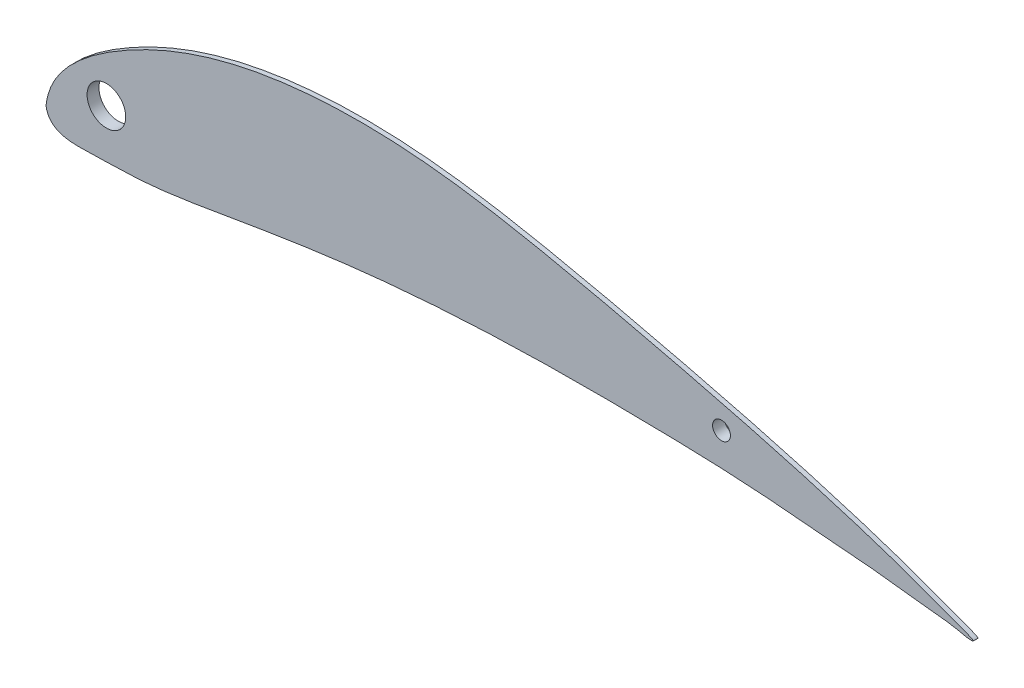
ISO-10303-21;
HEADER;
FILE_DESCRIPTION(('STEP AP214'),'2;1');
FILE_NAME('part.step','',(''),(''),'','','');
FILE_SCHEMA(('AUTOMOTIVE_DESIGN { 1 0 10303 214 1 1 1 1 }'));
ENDSEC;
DATA;
#1=APPLICATION_CONTEXT('core data for automotive mechanical design processes');
#2=APPLICATION_PROTOCOL_DEFINITION('international standard','automotive_design',2000,#1);
#3=PRODUCT_CONTEXT('',#1,'mechanical');
#4=PRODUCT('Part','Part','',(#3));
#5=PRODUCT_RELATED_PRODUCT_CATEGORY('part','',(#4));
#6=PRODUCT_DEFINITION_FORMATION('','',#4);
#7=PRODUCT_DEFINITION_CONTEXT('part definition',#1,'design');
#8=PRODUCT_DEFINITION('design','',#6,#7);
#9=PRODUCT_DEFINITION_SHAPE('','',#8);
#10=(LENGTH_UNIT() NAMED_UNIT(*) SI_UNIT(.MILLI.,.METRE.));
#11=(NAMED_UNIT(*) PLANE_ANGLE_UNIT() SI_UNIT($,.RADIAN.));
#12=(NAMED_UNIT(*) SI_UNIT($,.STERADIAN.) SOLID_ANGLE_UNIT());
#13=UNCERTAINTY_MEASURE_WITH_UNIT(LENGTH_MEASURE(1.E-05),#10,'distance_accuracy_value','');
#14=(GEOMETRIC_REPRESENTATION_CONTEXT(3) GLOBAL_UNCERTAINTY_ASSIGNED_CONTEXT((#13)) GLOBAL_UNIT_ASSIGNED_CONTEXT((#10,
#11,#12)) REPRESENTATION_CONTEXT('',''));
#15=CARTESIAN_POINT('',(0.,0.,0.));
#16=DIRECTION('',(0.,0.,1.));
#17=DIRECTION('',(1.,0.,0.));
#18=AXIS2_PLACEMENT_3D('',#15,#16,#17);
#19=CARTESIAN_POINT('',(0.000560351162113587,0.000130087070423624,1.5875));
#20=CARTESIAN_POINT('',(1.23071418869678,-6.92407609127206,1.5875));
#21=CARTESIAN_POINT('',(15.3166033306834,-6.18906584099094,1.5875));
#22=CARTESIAN_POINT('',(36.4546728163185,-6.09849990105009,1.5875));
#23=CARTESIAN_POINT('',(66.5061971849192,-0.586669106973501,1.5875));
#24=CARTESIAN_POINT('',(110.497331171581,6.18149522271792,1.5875));
#25=CARTESIAN_POINT('',(157.718638091679,9.03065014873911,1.5875));
#26=CARTESIAN_POINT('',(205.10142463584,8.83808028186313,1.5875));
#27=CARTESIAN_POINT('',(235.858814759408,7.87030619247826,1.5875));
#28=CARTESIAN_POINT('',(260.846344817159,5.42741339404395,1.5875));
#29=CARTESIAN_POINT('',(276.264022989737,4.51435670375389,1.5875));
#30=CARTESIAN_POINT('',(293.989507544058,2.09398731346533,1.5875));
#31=CARTESIAN_POINT('',(303.956832564589,1.47095520994628,1.5875));
#32=CARTESIAN_POINT('',(309.846313894505,0.000130087070423666,1.5875));
#33=B_SPLINE_CURVE_WITH_KNOTS('',3,(#19,#20,#21,#22,#23,#24,#25,#26,#27,#28,#29,#30,#31,#32),
.UNSPECIFIED.,.F.,.F.,(4,1,1,1,1,1,1,1,1,1,1,4),(0.,0.0569078595717698,0.106482711504673,
0.214488052979465,0.341297688349143,0.535095665520157,0.664680853556909,0.794660698192775,
0.828978881532905,0.904725108725214,0.942212919019968,1.),.UNSPECIFIED.);
#34=DIRECTION('',(0.,0.,-1.));
#35=VECTOR('',#34,1.);
#36=SURFACE_OF_LINEAR_EXTRUSION('',#33,#35);
#37=CARTESIAN_POINT('',(0.000560351162113587,0.000130087070423624,0.));
#38=CARTESIAN_POINT('',(1.23071418869678,-6.92407609127206,0.));
#39=CARTESIAN_POINT('',(15.3166033306834,-6.18906584099094,0.));
#40=CARTESIAN_POINT('',(36.4546728163185,-6.09849990105009,0.));
#41=CARTESIAN_POINT('',(66.5061971849192,-0.586669106973501,0.));
#42=CARTESIAN_POINT('',(110.497331171581,6.18149522271792,0.));
#43=CARTESIAN_POINT('',(157.718638091679,9.03065014873911,0.));
#44=CARTESIAN_POINT('',(205.10142463584,8.83808028186313,0.));
#45=CARTESIAN_POINT('',(235.858814759408,7.87030619247826,0.));
#46=CARTESIAN_POINT('',(260.846344817159,5.42741339404395,0.));
#47=CARTESIAN_POINT('',(276.264022989737,4.51435670375389,0.));
#48=CARTESIAN_POINT('',(293.989507544058,2.09398731346533,0.));
#49=CARTESIAN_POINT('',(303.956832564589,1.47095520994628,0.));
#50=CARTESIAN_POINT('',(309.846313894505,0.000130087070423666,0.));
#51=B_SPLINE_CURVE_WITH_KNOTS('',3,(#37,#38,#39,#40,#41,#42,#43,#44,#45,#46,#47,#48,#49,#50),
.UNSPECIFIED.,.F.,.F.,(4,1,1,1,1,1,1,1,1,1,1,4),(0.,0.0569078595717698,0.106482711504673,
0.214488052979465,0.341297688349143,0.535095665520157,0.664680853556909,0.794660698192775,
0.828978881532905,0.904725108725214,0.942212919019968,1.),.UNSPECIFIED.);
#52=CARTESIAN_POINT('',(0.000560351162116727,0.000130087070423829,0.));
#53=VERTEX_POINT('',#52);
#54=CARTESIAN_POINT('',(309.846313894505,0.000130087070423864,0.));
#55=VERTEX_POINT('',#54);
#56=EDGE_CURVE('E80',#53,#55,#51,.T.);
#57=ORIENTED_EDGE('',*,*,#56,.T.);
#58=DIRECTION('',(0.,0.,-1.));
#59=VECTOR('',#58,1.);
#60=CARTESIAN_POINT('',(309.846313894505,0.000130087070423864,1.5875));
#61=LINE('',#60,#59);
#62=CARTESIAN_POINT('',(309.846313894505,0.000130087070423864,1.5875));
#63=VERTEX_POINT('',#62);
#64=EDGE_CURVE('E76',#63,#55,#61,.T.);
#65=ORIENTED_EDGE('',*,*,#64,.F.);
#66=CARTESIAN_POINT('',(0.000560351162116727,0.000130087070423829,1.5875));
#67=VERTEX_POINT('',#66);
#68=EDGE_CURVE('E79',#67,#63,#33,.T.);
#69=ORIENTED_EDGE('',*,*,#68,.F.);
#70=DIRECTION('',(0.,0.,-1.));
#71=VECTOR('',#70,1.);
#72=CARTESIAN_POINT('',(0.000560351162116727,0.000130087070423829,1.5875));
#73=LINE('',#72,#71);
#74=EDGE_CURVE('E73',#67,#53,#73,.T.);
#75=ORIENTED_EDGE('',*,*,#74,.T.);
#76=EDGE_LOOP('',(#57,#65,#69,#75));
#77=FACE_BOUND('',#76,.T.);
#78=ADVANCED_FACE('F43',(#77),#36,.F.);
#79=CARTESIAN_POINT('',(309.846313894505,0.000130087070423864,1.5875));
#80=CARTESIAN_POINT('',(314.816918223261,-0.51620674157964,1.5875));
#81=CARTESIAN_POINT('',(301.273197720551,4.38282813873556,1.5875));
#82=CARTESIAN_POINT('',(290.359837670022,8.71099439045776,1.5875));
#83=CARTESIAN_POINT('',(256.952064400645,19.5289209482833,1.5875));
#84=CARTESIAN_POINT('',(217.961060472083,29.6129748944238,1.5875));
#85=CARTESIAN_POINT('',(173.256699242147,40.0411042779434,1.5875));
#86=CARTESIAN_POINT('',(131.400792108858,47.8848319151037,1.5875));
#87=CARTESIAN_POINT('',(89.5976184754884,49.290763053775,1.5875));
#88=CARTESIAN_POINT('',(52.1111282710831,42.0692152748914,1.5875));
#89=CARTESIAN_POINT('',(26.2867198183782,29.9751763284633,1.5875));
#90=CARTESIAN_POINT('',(8.64909202481883,17.8566051741579,1.5875));
#91=CARTESIAN_POINT('',(0.810633126632263,7.35919605469637,1.5875));
#92=CARTESIAN_POINT('',(0.000560351162116727,0.000130087070423829,1.5875));
#93=B_SPLINE_CURVE_WITH_KNOTS('',3,(#79,#80,#81,#82,#83,#84,#85,#86,#87,#88,#89,#90,#91,#92),
.UNSPECIFIED.,.F.,.F.,(4,1,1,1,1,1,1,1,1,1,1,4),(0.,0.0239417713693992,0.070244030177139,
0.147561721425381,0.308455887006792,0.442387865106874,0.551517565626309,0.687091076796298,
0.811391258419108,0.886311735305172,0.939136382225768,1.),.UNSPECIFIED.);
#94=DIRECTION('',(0.,0.,-1.));
#95=VECTOR('',#94,1.);
#96=SURFACE_OF_LINEAR_EXTRUSION('',#93,#95);
#97=CARTESIAN_POINT('',(309.846313894505,0.000130087070423864,0.));
#98=CARTESIAN_POINT('',(314.816918223261,-0.51620674157964,0.));
#99=CARTESIAN_POINT('',(301.273197720551,4.38282813873556,0.));
#100=CARTESIAN_POINT('',(290.359837670022,8.71099439045776,0.));
#101=CARTESIAN_POINT('',(256.952064400645,19.5289209482833,0.));
#102=CARTESIAN_POINT('',(217.961060472083,29.6129748944238,0.));
#103=CARTESIAN_POINT('',(173.256699242147,40.0411042779434,0.));
#104=CARTESIAN_POINT('',(131.400792108858,47.8848319151037,0.));
#105=CARTESIAN_POINT('',(89.5976184754884,49.290763053775,0.));
#106=CARTESIAN_POINT('',(52.1111282710831,42.0692152748914,0.));
#107=CARTESIAN_POINT('',(26.2867198183782,29.9751763284633,0.));
#108=CARTESIAN_POINT('',(8.64909202481883,17.8566051741579,0.));
#109=CARTESIAN_POINT('',(0.810633126632263,7.35919605469637,0.));
#110=CARTESIAN_POINT('',(0.000560351162116727,0.000130087070423829,0.));
#111=B_SPLINE_CURVE_WITH_KNOTS('',3,(#97,#98,#99,#100,#101,#102,#103,#104,#105,#106,#107,#108,
#109,#110),.UNSPECIFIED.,.F.,.F.,(4,1,1,1,1,1,1,1,1,1,1,4),(0.,0.0239417713693992,
0.070244030177139,0.147561721425381,0.308455887006792,0.442387865106874,0.551517565626309,
0.687091076796298,0.811391258419108,0.886311735305172,0.939136382225768,1.),.UNSPECIFIED.);
#112=EDGE_CURVE('E68',#55,#53,#111,.T.);
#113=ORIENTED_EDGE('',*,*,#112,.T.);
#114=ORIENTED_EDGE('',*,*,#74,.F.);
#115=EDGE_CURVE('E60',#63,#67,#93,.T.);
#116=ORIENTED_EDGE('',*,*,#115,.F.);
#117=ORIENTED_EDGE('',*,*,#64,.T.);
#118=EDGE_LOOP('',(#113,#114,#116,#117));
#119=FACE_BOUND('',#118,.T.);
#120=ADVANCED_FACE('F72',(#119),#96,.F.);
#121=CARTESIAN_POINT('',(153.387816973495,8.33338198857885,1.5875));
#122=DIRECTION('',(0.,0.,-1.));
#123=DIRECTION('',(-1.,0.,0.));
#124=AXIS2_PLACEMENT_3D('',#121,#122,#123);
#125=PLANE('',#124);
#126=CARTESIAN_POINT('',(20.32,10.16,1.5875));
#127=DIRECTION('',(0.,0.,1.));
#128=DIRECTION('',(1.,0.,0.));
#129=AXIS2_PLACEMENT_3D('',#126,#127,#128);
#130=CIRCLE('',#129,6.5);
#131=CARTESIAN_POINT('',(26.82,10.16,1.5875));
#132=VERTEX_POINT('',#131);
#133=EDGE_CURVE('E232',#132,#132,#130,.T.);
#134=ORIENTED_EDGE('',*,*,#133,.F.);
#135=EDGE_LOOP('',(#134));
#136=FACE_BOUND('',#135,.T.);
#137=CARTESIAN_POINT('',(227.296313894505,19.0501300870704,1.5875));
#138=DIRECTION('',(0.,0.,1.));
#139=DIRECTION('',(1.,0.,0.));
#140=AXIS2_PLACEMENT_3D('',#137,#138,#139);
#141=CIRCLE('',#140,2.99999999999999);
#142=CARTESIAN_POINT('',(230.296313894505,19.0501300870704,1.5875));
#143=VERTEX_POINT('',#142);
#144=EDGE_CURVE('E233',#143,#143,#141,.T.);
#145=ORIENTED_EDGE('',*,*,#144,.F.);
#146=EDGE_LOOP('',(#145));
#147=FACE_BOUND('',#146,.T.);
#148=ORIENTED_EDGE('',*,*,#68,.T.);
#149=ORIENTED_EDGE('',*,*,#115,.T.);
#150=EDGE_LOOP('',(#148,#149));
#151=FACE_BOUND('',#150,.T.);
#152=ADVANCED_FACE('F118',(#136,#147,#151),#125,.F.);
#153=CARTESIAN_POINT('',(153.387816973495,8.33338198857885,0.));
#154=DIRECTION('',(0.,0.,-1.));
#155=DIRECTION('',(-1.,0.,0.));
#156=AXIS2_PLACEMENT_3D('',#153,#154,#155);
#157=PLANE('',#156);
#158=CARTESIAN_POINT('',(20.32,10.16,0.));
#159=DIRECTION('',(0.,0.,-1.));
#160=DIRECTION('',(-1.,0.,0.));
#161=AXIS2_PLACEMENT_3D('',#158,#159,#160);
#162=CIRCLE('',#161,8.);
#163=CARTESIAN_POINT('',(12.32,10.16,0.));
#164=VERTEX_POINT('',#163);
#165=EDGE_CURVE('E11',#164,#164,#162,.T.);
#166=ORIENTED_EDGE('',*,*,#165,.F.);
#167=EDGE_LOOP('',(#166));
#168=FACE_BOUND('',#167,.T.);
#169=CARTESIAN_POINT('',(227.296313894505,19.0501300870704,0.));
#170=DIRECTION('',(0.,0.,-1.));
#171=DIRECTION('',(-1.,0.,0.));
#172=AXIS2_PLACEMENT_3D('',#169,#170,#171);
#173=CIRCLE('',#172,4.49999999999999);
#174=CARTESIAN_POINT('',(222.796313894505,19.0501300870704,0.));
#175=VERTEX_POINT('',#174);
#176=EDGE_CURVE('E53',#175,#175,#173,.T.);
#177=ORIENTED_EDGE('',*,*,#176,.F.);
#178=EDGE_LOOP('',(#177));
#179=FACE_BOUND('',#178,.T.);
#180=ORIENTED_EDGE('',*,*,#56,.F.);
#181=ORIENTED_EDGE('',*,*,#112,.F.);
#182=EDGE_LOOP('',(#180,#181));
#183=FACE_BOUND('',#182,.T.);
#184=ADVANCED_FACE('F85',(#168,#179,#183),#157,.T.);
#185=CARTESIAN_POINT('',(227.296313894505,19.0501300870704,-2.4125));
#186=DIRECTION('',(0.,0.,1.));
#187=DIRECTION('',(1.,0.,0.));
#188=AXIS2_PLACEMENT_3D('',#185,#186,#187);
#189=CYLINDRICAL_SURFACE('',#188,2.99999999999999);
#190=CARTESIAN_POINT('',(227.296313894505,19.0501300870704,-2.4125));
#191=DIRECTION('',(0.,0.,1.));
#192=DIRECTION('',(1.,0.,0.));
#193=AXIS2_PLACEMENT_3D('',#190,#191,#192);
#194=CIRCLE('',#193,2.99999999999999);
#195=CARTESIAN_POINT('',(230.296313894505,19.0501300870704,-2.4125));
#196=VERTEX_POINT('',#195);
#197=EDGE_CURVE('E91',#196,#196,#194,.T.);
#198=ORIENTED_EDGE('',*,*,#197,.F.);
#199=EDGE_LOOP('',(#198));
#200=FACE_BOUND('',#199,.T.);
#201=ORIENTED_EDGE('',*,*,#144,.T.);
#202=EDGE_LOOP('',(#201));
#203=FACE_BOUND('',#202,.T.);
#204=ADVANCED_FACE('F117',(#200,#203),#189,.F.);
#205=CARTESIAN_POINT('',(227.296313894505,19.0501300870704,-2.4125));
#206=DIRECTION('',(0.,0.,1.));
#207=DIRECTION('',(1.,0.,0.));
#208=AXIS2_PLACEMENT_3D('',#205,#206,#207);
#209=CYLINDRICAL_SURFACE('',#208,4.49999999999999);
#210=ORIENTED_EDGE('',*,*,#176,.T.);
#211=EDGE_LOOP('',(#210));
#212=FACE_BOUND('',#211,.T.);
#213=CARTESIAN_POINT('',(227.296313894505,19.0501300870704,-2.4125));
#214=DIRECTION('',(0.,0.,1.));
#215=DIRECTION('',(1.,0.,0.));
#216=AXIS2_PLACEMENT_3D('',#213,#214,#215);
#217=CIRCLE('',#216,4.49999999999999);
#218=CARTESIAN_POINT('',(231.796313894505,19.0501300870704,-2.4125));
#219=VERTEX_POINT('',#218);
#220=EDGE_CURVE('E87',#219,#219,#217,.T.);
#221=ORIENTED_EDGE('',*,*,#220,.T.);
#222=EDGE_LOOP('',(#221));
#223=FACE_BOUND('',#222,.T.);
#224=ADVANCED_FACE('F113',(#212,#223),#209,.T.);
#225=CARTESIAN_POINT('',(0.,0.,-2.4125));
#226=DIRECTION('',(0.,0.,1.));
#227=DIRECTION('',(1.,0.,0.));
#228=AXIS2_PLACEMENT_3D('',#225,#226,#227);
#229=PLANE('',#228);
#230=ORIENTED_EDGE('',*,*,#197,.T.);
#231=EDGE_LOOP('',(#230));
#232=FACE_BOUND('',#231,.T.);
#233=ORIENTED_EDGE('',*,*,#220,.F.);
#234=EDGE_LOOP('',(#233));
#235=FACE_BOUND('',#234,.T.);
#236=ADVANCED_FACE('F165',(#232,#235),#229,.F.);
#237=CARTESIAN_POINT('',(20.32,10.16,-2.4125));
#238=DIRECTION('',(0.,0.,1.));
#239=DIRECTION('',(1.,0.,0.));
#240=AXIS2_PLACEMENT_3D('',#237,#238,#239);
#241=CYLINDRICAL_SURFACE('',#240,6.5);
#242=CARTESIAN_POINT('',(20.32,10.16,-2.4125));
#243=DIRECTION('',(0.,0.,1.));
#244=DIRECTION('',(1.,0.,0.));
#245=AXIS2_PLACEMENT_3D('',#242,#243,#244);
#246=CIRCLE('',#245,6.5);
#247=CARTESIAN_POINT('',(26.82,10.16,-2.4125));
#248=VERTEX_POINT('',#247);
#249=EDGE_CURVE('E219',#248,#248,#246,.T.);
#250=ORIENTED_EDGE('',*,*,#249,.F.);
#251=EDGE_LOOP('',(#250));
#252=FACE_BOUND('',#251,.T.);
#253=ORIENTED_EDGE('',*,*,#133,.T.);
#254=EDGE_LOOP('',(#253));
#255=FACE_BOUND('',#254,.T.);
#256=ADVANCED_FACE('F161',(#252,#255),#241,.F.);
#257=CARTESIAN_POINT('',(20.32,10.16,-2.4125));
#258=DIRECTION('',(0.,0.,1.));
#259=DIRECTION('',(1.,0.,0.));
#260=AXIS2_PLACEMENT_3D('',#257,#258,#259);
#261=CYLINDRICAL_SURFACE('',#260,8.);
#262=ORIENTED_EDGE('',*,*,#165,.T.);
#263=EDGE_LOOP('',(#262));
#264=FACE_BOUND('',#263,.T.);
#265=CARTESIAN_POINT('',(20.32,10.16,-2.4125));
#266=DIRECTION('',(0.,0.,1.));
#267=DIRECTION('',(1.,0.,0.));
#268=AXIS2_PLACEMENT_3D('',#265,#266,#267);
#269=CIRCLE('',#268,8.);
#270=CARTESIAN_POINT('',(28.32,10.16,-2.4125));
#271=VERTEX_POINT('',#270);
#272=EDGE_CURVE('E215',#271,#271,#269,.T.);
#273=ORIENTED_EDGE('',*,*,#272,.T.);
#274=EDGE_LOOP('',(#273));
#275=FACE_BOUND('',#274,.T.);
#276=ADVANCED_FACE('F164',(#264,#275),#261,.T.);
#277=CARTESIAN_POINT('',(0.,0.,-2.4125));
#278=DIRECTION('',(0.,0.,1.));
#279=DIRECTION('',(1.,0.,0.));
#280=AXIS2_PLACEMENT_3D('',#277,#278,#279);
#281=PLANE('',#280);
#282=ORIENTED_EDGE('',*,*,#249,.T.);
#283=EDGE_LOOP('',(#282));
#284=FACE_BOUND('',#283,.T.);
#285=ORIENTED_EDGE('',*,*,#272,.F.);
#286=EDGE_LOOP('',(#285));
#287=FACE_BOUND('',#286,.T.);
#288=ADVANCED_FACE('F147',(#284,#287),#281,.F.);
#289=CLOSED_SHELL('',(#78,#120,#152,#184,#204,#224,#236,#256,#276,#288));
#290=MANIFOLD_SOLID_BREP('B2',#289);
#291=ADVANCED_BREP_SHAPE_REPRESENTATION('',(#18,#290),#14);
#292=SHAPE_DEFINITION_REPRESENTATION(#9,#291);
ENDSEC;
END-ISO-10303-21;
